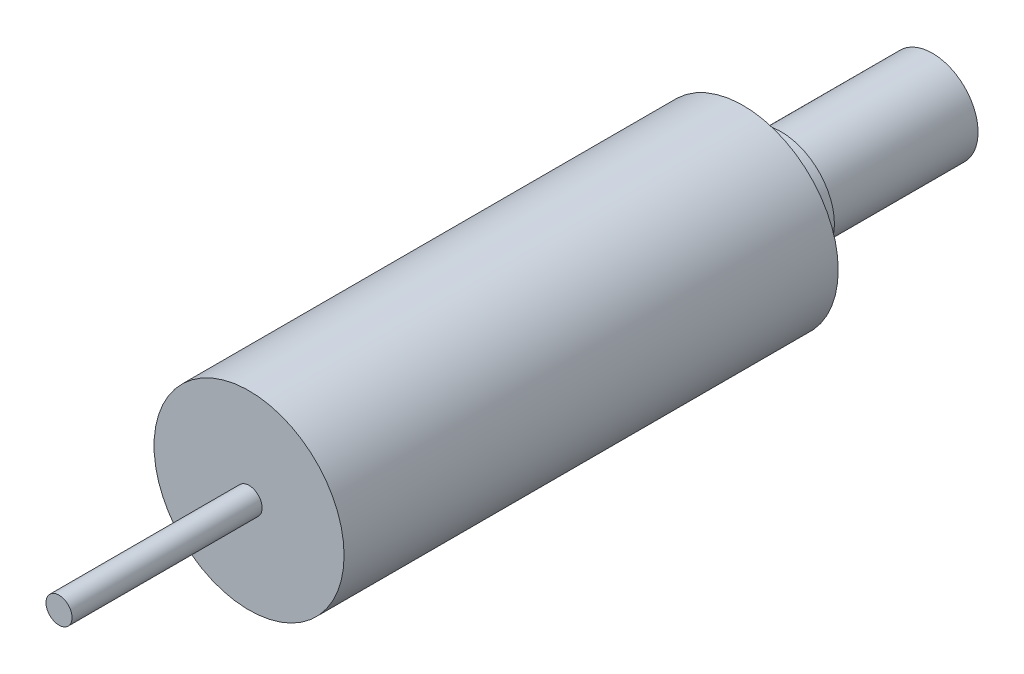
ISO-10303-21;
HEADER;
FILE_DESCRIPTION(('STEP AP214'),'2;1');
FILE_NAME('part.step','',(''),(''),'','','');
FILE_SCHEMA(('AUTOMOTIVE_DESIGN { 1 0 10303 214 1 1 1 1 }'));
ENDSEC;
DATA;
#1=APPLICATION_CONTEXT('core data for automotive mechanical design processes');
#2=APPLICATION_PROTOCOL_DEFINITION('international standard','automotive_design',2000,#1);
#3=PRODUCT_CONTEXT('',#1,'mechanical');
#4=PRODUCT('Part','Part','',(#3));
#5=PRODUCT_RELATED_PRODUCT_CATEGORY('part','',(#4));
#6=PRODUCT_DEFINITION_FORMATION('','',#4);
#7=PRODUCT_DEFINITION_CONTEXT('part definition',#1,'design');
#8=PRODUCT_DEFINITION('design','',#6,#7);
#9=PRODUCT_DEFINITION_SHAPE('','',#8);
#10=(LENGTH_UNIT() NAMED_UNIT(*) SI_UNIT(.MILLI.,.METRE.));
#11=(NAMED_UNIT(*) PLANE_ANGLE_UNIT() SI_UNIT($,.RADIAN.));
#12=(NAMED_UNIT(*) SI_UNIT($,.STERADIAN.) SOLID_ANGLE_UNIT());
#13=UNCERTAINTY_MEASURE_WITH_UNIT(LENGTH_MEASURE(1.E-05),#10,'distance_accuracy_value','');
#14=(GEOMETRIC_REPRESENTATION_CONTEXT(3) GLOBAL_UNCERTAINTY_ASSIGNED_CONTEXT((#13)) GLOBAL_UNIT_ASSIGNED_CONTEXT((#10,
#11,#12)) REPRESENTATION_CONTEXT('',''));
#15=CARTESIAN_POINT('',(0.,0.,0.));
#16=DIRECTION('',(0.,0.,1.));
#17=DIRECTION('',(1.,0.,0.));
#18=AXIS2_PLACEMENT_3D('',#15,#16,#17);
#19=CARTESIAN_POINT('',(0.,0.,19.9));
#20=DIRECTION('',(0.,0.,-1.));
#21=DIRECTION('',(-1.,0.,0.));
#22=AXIS2_PLACEMENT_3D('',#19,#20,#21);
#23=CYLINDRICAL_SURFACE('',#22,6.00000000000001);
#24=CARTESIAN_POINT('',(0.,0.,19.9));
#25=DIRECTION('',(0.,0.,1.));
#26=DIRECTION('',(1.,0.,0.));
#27=AXIS2_PLACEMENT_3D('',#24,#25,#26);
#28=CIRCLE('',#27,6.00000000000001);
#29=CARTESIAN_POINT('',(-6.00000000000001,0.,19.9));
#30=VERTEX_POINT('',#29);
#31=EDGE_CURVE('E10',#30,#30,#28,.T.);
#32=CARTESIAN_POINT('',(0.,0.,0.));
#33=DIRECTION('',(0.,0.,1.));
#34=DIRECTION('',(1.,0.,0.));
#35=AXIS2_PLACEMENT_3D('',#32,#33,#34);
#36=CIRCLE('',#35,6.00000000000001);
#37=CARTESIAN_POINT('',(-6.00000000000001,0.,0.));
#38=VERTEX_POINT('',#37);
#39=EDGE_CURVE('E33',#38,#38,#36,.T.);
#40=CARTESIAN_POINT('',(-6.00000000000001,0.,19.9));
#41=CARTESIAN_POINT('',(-6.00000000000001,0.,19.6927083333333));
#42=CARTESIAN_POINT('',(-6.00000000000001,0.,19.4854166666667));
#43=CARTESIAN_POINT('',(-6.00000000000001,0.,19.0708333333333));
#44=CARTESIAN_POINT('',(-6.00000000000001,0.,18.8635416666667));
#45=CARTESIAN_POINT('',(-6.00000000000001,0.,18.4489583333333));
#46=CARTESIAN_POINT('',(-6.00000000000001,0.,18.2416666666667));
#47=CARTESIAN_POINT('',(-6.00000000000001,0.,17.8270833333333));
#48=CARTESIAN_POINT('',(-6.00000000000001,0.,17.6197916666667));
#49=CARTESIAN_POINT('',(-6.00000000000001,0.,17.2052083333333));
#50=CARTESIAN_POINT('',(-6.00000000000001,0.,16.9979166666667));
#51=CARTESIAN_POINT('',(-6.00000000000001,0.,16.5833333333333));
#52=CARTESIAN_POINT('',(-6.00000000000001,0.,16.3760416666667));
#53=CARTESIAN_POINT('',(-6.00000000000001,0.,15.9614583333333));
#54=CARTESIAN_POINT('',(-6.00000000000001,0.,15.7541666666667));
#55=CARTESIAN_POINT('',(-6.00000000000001,0.,15.3395833333333));
#56=CARTESIAN_POINT('',(-6.00000000000001,0.,15.1322916666667));
#57=CARTESIAN_POINT('',(-6.00000000000001,0.,14.7177083333333));
#58=CARTESIAN_POINT('',(-6.00000000000001,0.,14.5104166666667));
#59=CARTESIAN_POINT('',(-6.00000000000001,0.,14.0958333333333));
#60=CARTESIAN_POINT('',(-6.00000000000001,0.,13.8885416666667));
#61=CARTESIAN_POINT('',(-6.00000000000001,0.,13.4739583333333));
#62=CARTESIAN_POINT('',(-6.00000000000001,0.,13.2666666666667));
#63=CARTESIAN_POINT('',(-6.00000000000001,0.,12.8520833333333));
#64=CARTESIAN_POINT('',(-6.00000000000001,0.,12.6447916666667));
#65=CARTESIAN_POINT('',(-6.00000000000001,0.,12.2302083333333));
#66=CARTESIAN_POINT('',(-6.00000000000001,0.,12.0229166666667));
#67=CARTESIAN_POINT('',(-6.00000000000001,0.,11.6083333333333));
#68=CARTESIAN_POINT('',(-6.00000000000001,0.,11.4010416666667));
#69=CARTESIAN_POINT('',(-6.00000000000001,0.,10.9864583333333));
#70=CARTESIAN_POINT('',(-6.00000000000001,0.,10.7791666666667));
#71=CARTESIAN_POINT('',(-6.00000000000001,0.,10.3645833333333));
#72=CARTESIAN_POINT('',(-6.00000000000001,0.,10.1572916666667));
#73=CARTESIAN_POINT('',(-6.00000000000001,0.,9.74270833333333));
#74=CARTESIAN_POINT('',(-6.00000000000001,0.,9.53541666666666));
#75=CARTESIAN_POINT('',(-6.00000000000001,0.,9.12083333333333));
#76=CARTESIAN_POINT('',(-6.00000000000001,0.,8.91354166666666));
#77=CARTESIAN_POINT('',(-6.00000000000001,0.,8.49895833333333));
#78=CARTESIAN_POINT('',(-6.00000000000001,0.,8.29166666666666));
#79=CARTESIAN_POINT('',(-6.00000000000001,0.,7.87708333333333));
#80=CARTESIAN_POINT('',(-6.00000000000001,0.,7.66979166666666));
#81=CARTESIAN_POINT('',(-6.00000000000001,0.,7.25520833333333));
#82=CARTESIAN_POINT('',(-6.00000000000001,0.,7.04791666666666));
#83=CARTESIAN_POINT('',(-6.00000000000001,0.,6.63333333333333));
#84=CARTESIAN_POINT('',(-6.00000000000001,0.,6.42604166666666));
#85=CARTESIAN_POINT('',(-6.00000000000001,0.,6.01145833333333));
#86=CARTESIAN_POINT('',(-6.00000000000001,0.,5.80416666666666));
#87=CARTESIAN_POINT('',(-6.00000000000001,0.,5.38958333333333));
#88=CARTESIAN_POINT('',(-6.00000000000001,0.,5.18229166666666));
#89=CARTESIAN_POINT('',(-6.00000000000001,0.,4.76770833333333));
#90=CARTESIAN_POINT('',(-6.00000000000001,0.,4.56041666666666));
#91=CARTESIAN_POINT('',(-6.00000000000001,0.,4.14583333333333));
#92=CARTESIAN_POINT('',(-6.00000000000001,0.,3.93854166666666));
#93=CARTESIAN_POINT('',(-6.00000000000001,0.,3.52395833333333));
#94=CARTESIAN_POINT('',(-6.00000000000001,0.,3.31666666666667));
#95=CARTESIAN_POINT('',(-6.00000000000001,0.,2.90208333333333));
#96=CARTESIAN_POINT('',(-6.00000000000001,0.,2.69479166666667));
#97=CARTESIAN_POINT('',(-6.00000000000001,0.,2.28020833333333));
#98=CARTESIAN_POINT('',(-6.00000000000001,0.,2.07291666666667));
#99=CARTESIAN_POINT('',(-6.00000000000001,0.,1.65833333333333));
#100=CARTESIAN_POINT('',(-6.00000000000001,0.,1.45104166666667));
#101=CARTESIAN_POINT('',(-6.00000000000001,0.,1.03645833333333));
#102=CARTESIAN_POINT('',(-6.00000000000001,0.,0.829166666666668));
#103=CARTESIAN_POINT('',(-6.00000000000001,0.,0.414583333333334));
#104=CARTESIAN_POINT('',(-6.00000000000001,0.,0.207291666666667));
#105=CARTESIAN_POINT('',(-6.00000000000001,0.,0.));
#106=B_SPLINE_CURVE_WITH_KNOTS('',3,(#40,#41,#42,#43,#44,#45,#46,#47,#48,#49,#50,#51,#52,#53,
#54,#55,#56,#57,#58,#59,#60,#61,#62,#63,#64,#65,#66,#67,#68,#69,#70,#71,#72,#73,#74,#75,#76,#77,
#78,#79,#80,#81,#82,#83,#84,#85,#86,#87,#88,#89,#90,#91,#92,#93,#94,#95,#96,#97,#98,#99,#100,
#101,#102,#103,#104,#105),.UNSPECIFIED.,.F.,.F.,(4,2,2,2,2,2,2,2,2,2,2,2,2,2,2,2,2,2,2,2,2,2,2,
2,2,2,2,2,2,2,2,2,4),(0.,0.621875000000001,1.24375,1.865625,2.4875,3.109375,3.73125,4.353125,
4.975,5.596875,6.21875,6.840625,7.4625,8.084375,8.70625,9.328125,9.95,10.571875,11.19375,
11.815625,12.4375,13.059375,13.68125,14.303125,14.925,15.546875,16.16875,16.790625,17.4125,
18.034375,18.65625,19.278125,19.9),.UNSPECIFIED.);
#107=EDGE_CURVE('BSEAM30',#30,#38,#106,.T.);
#108=ORIENTED_EDGE('',*,*,#31,.F.);
#109=ORIENTED_EDGE('',*,*,#39,.T.);
#110=ORIENTED_EDGE('',*,*,#107,.T.);
#111=ORIENTED_EDGE('',*,*,#107,.F.);
#112=EDGE_LOOP('',(#108,#110,#109,#111));
#113=FACE_BOUND('',#112,.T.);
#114=ADVANCED_FACE('F30',(#113),#23,.T.);
#115=CARTESIAN_POINT('',(0.,0.,0.));
#116=DIRECTION('',(0.,0.,1.));
#117=DIRECTION('',(1.,0.,0.));
#118=AXIS2_PLACEMENT_3D('',#115,#116,#117);
#119=PLANE('',#118);
#120=CARTESIAN_POINT('',(0.,0.,0.));
#121=DIRECTION('',(0.,0.,-1.));
#122=DIRECTION('',(-1.,0.,0.));
#123=AXIS2_PLACEMENT_3D('',#120,#121,#122);
#124=CIRCLE('',#123,3.);
#125=CARTESIAN_POINT('',(-3.,0.,0.));
#126=VERTEX_POINT('',#125);
#127=EDGE_CURVE('E60',#126,#126,#124,.T.);
#128=ORIENTED_EDGE('',*,*,#127,.F.);
#129=EDGE_LOOP('',(#128));
#130=FACE_BOUND('',#129,.T.);
#131=ORIENTED_EDGE('',*,*,#39,.F.);
#132=EDGE_LOOP('',(#131));
#133=FACE_BOUND('',#132,.T.);
#134=ADVANCED_FACE('F75',(#130,#133),#119,.F.);
#135=CARTESIAN_POINT('',(0.,0.,24.9));
#136=DIRECTION('',(0.,0.,-1.));
#137=DIRECTION('',(-1.,0.,0.));
#138=AXIS2_PLACEMENT_3D('',#135,#136,#137);
#139=CYLINDRICAL_SURFACE('',#138,7.);
#140=CARTESIAN_POINT('',(0.,0.,24.9));
#141=DIRECTION('',(0.,0.,1.));
#142=DIRECTION('',(1.,0.,0.));
#143=AXIS2_PLACEMENT_3D('',#140,#141,#142);
#144=CIRCLE('',#143,7.);
#145=CARTESIAN_POINT('',(7.,0.,24.9));
#146=VERTEX_POINT('',#145);
#147=EDGE_CURVE('E40',#146,#146,#144,.T.);
#148=ORIENTED_EDGE('',*,*,#147,.F.);
#149=EDGE_LOOP('',(#148));
#150=FACE_BOUND('',#149,.T.);
#151=CARTESIAN_POINT('',(0.,0.,19.9));
#152=DIRECTION('',(0.,0.,1.));
#153=DIRECTION('',(1.,0.,0.));
#154=AXIS2_PLACEMENT_3D('',#151,#152,#153);
#155=CIRCLE('',#154,7.);
#156=CARTESIAN_POINT('',(7.,0.,19.9));
#157=VERTEX_POINT('',#156);
#158=EDGE_CURVE('E42',#157,#157,#155,.T.);
#159=ORIENTED_EDGE('',*,*,#158,.T.);
#160=EDGE_LOOP('',(#159));
#161=FACE_BOUND('',#160,.T.);
#162=ADVANCED_FACE('F78',(#150,#161),#139,.T.);
#163=CARTESIAN_POINT('',(0.,0.,19.9));
#164=DIRECTION('',(0.,0.,1.));
#165=DIRECTION('',(1.,0.,0.));
#166=AXIS2_PLACEMENT_3D('',#163,#164,#165);
#167=PLANE('',#166);
#168=ORIENTED_EDGE('',*,*,#31,.T.);
#169=EDGE_LOOP('',(#168));
#170=FACE_BOUND('',#169,.T.);
#171=ORIENTED_EDGE('',*,*,#158,.F.);
#172=EDGE_LOOP('',(#171));
#173=FACE_BOUND('',#172,.T.);
#174=ADVANCED_FACE('F97',(#170,#173),#167,.F.);
#175=CARTESIAN_POINT('',(0.,0.,89.9));
#176=DIRECTION('',(0.,0.,-1.));
#177=DIRECTION('',(-1.,0.,0.));
#178=AXIS2_PLACEMENT_3D('',#175,#176,#177);
#179=CYLINDRICAL_SURFACE('',#178,12.5);
#180=CARTESIAN_POINT('',(0.,0.,89.9));
#181=DIRECTION('',(0.,0.,1.));
#182=DIRECTION('',(1.,0.,0.));
#183=AXIS2_PLACEMENT_3D('',#180,#181,#182);
#184=CIRCLE('',#183,12.5);
#185=CARTESIAN_POINT('',(12.5,0.,89.9));
#186=VERTEX_POINT('',#185);
#187=EDGE_CURVE('E45',#186,#186,#184,.T.);
#188=ORIENTED_EDGE('',*,*,#187,.F.);
#189=EDGE_LOOP('',(#188));
#190=FACE_BOUND('',#189,.T.);
#191=CARTESIAN_POINT('',(0.,0.,24.9));
#192=DIRECTION('',(0.,0.,1.));
#193=DIRECTION('',(1.,0.,0.));
#194=AXIS2_PLACEMENT_3D('',#191,#192,#193);
#195=CIRCLE('',#194,12.5);
#196=CARTESIAN_POINT('',(12.5,0.,24.9));
#197=VERTEX_POINT('',#196);
#198=EDGE_CURVE('E48',#197,#197,#195,.T.);
#199=ORIENTED_EDGE('',*,*,#198,.T.);
#200=EDGE_LOOP('',(#199));
#201=FACE_BOUND('',#200,.T.);
#202=ADVANCED_FACE('F105',(#190,#201),#179,.T.);
#203=CARTESIAN_POINT('',(0.,0.,89.9));
#204=DIRECTION('',(0.,0.,1.));
#205=DIRECTION('',(1.,0.,0.));
#206=AXIS2_PLACEMENT_3D('',#203,#204,#205);
#207=PLANE('',#206);
#208=CARTESIAN_POINT('',(0.,0.,89.9));
#209=DIRECTION('',(0.,0.,1.));
#210=DIRECTION('',(1.,0.,0.));
#211=AXIS2_PLACEMENT_3D('',#208,#209,#210);
#212=CIRCLE('',#211,1.7148709961768);
#213=CARTESIAN_POINT('',(1.7148709961768,0.,89.9));
#214=VERTEX_POINT('',#213);
#215=EDGE_CURVE('E54',#214,#214,#212,.T.);
#216=ORIENTED_EDGE('',*,*,#215,.F.);
#217=EDGE_LOOP('',(#216));
#218=FACE_BOUND('',#217,.T.);
#219=ORIENTED_EDGE('',*,*,#187,.T.);
#220=EDGE_LOOP('',(#219));
#221=FACE_BOUND('',#220,.T.);
#222=ADVANCED_FACE('F112',(#218,#221),#207,.T.);
#223=CARTESIAN_POINT('',(0.,0.,24.9));
#224=DIRECTION('',(0.,0.,1.));
#225=DIRECTION('',(1.,0.,0.));
#226=AXIS2_PLACEMENT_3D('',#223,#224,#225);
#227=PLANE('',#226);
#228=ORIENTED_EDGE('',*,*,#147,.T.);
#229=EDGE_LOOP('',(#228));
#230=FACE_BOUND('',#229,.T.);
#231=ORIENTED_EDGE('',*,*,#198,.F.);
#232=EDGE_LOOP('',(#231));
#233=FACE_BOUND('',#232,.T.);
#234=ADVANCED_FACE('F121',(#230,#233),#227,.F.);
#235=CARTESIAN_POINT('',(0.,0.,114.9));
#236=DIRECTION('',(0.,0.,-1.));
#237=DIRECTION('',(-1.,0.,0.));
#238=AXIS2_PLACEMENT_3D('',#235,#236,#237);
#239=CYLINDRICAL_SURFACE('',#238,1.7148709961768);
#240=CARTESIAN_POINT('',(0.,0.,114.9));
#241=DIRECTION('',(0.,0.,1.));
#242=DIRECTION('',(1.,0.,0.));
#243=AXIS2_PLACEMENT_3D('',#240,#241,#242);
#244=CIRCLE('',#243,1.7148709961768);
#245=CARTESIAN_POINT('',(1.7148709961768,0.,114.9));
#246=VERTEX_POINT('',#245);
#247=EDGE_CURVE('E51',#246,#246,#244,.T.);
#248=ORIENTED_EDGE('',*,*,#247,.F.);
#249=EDGE_LOOP('',(#248));
#250=FACE_BOUND('',#249,.T.);
#251=ORIENTED_EDGE('',*,*,#215,.T.);
#252=EDGE_LOOP('',(#251));
#253=FACE_BOUND('',#252,.T.);
#254=ADVANCED_FACE('F129',(#250,#253),#239,.T.);
#255=CARTESIAN_POINT('',(0.,0.,114.9));
#256=DIRECTION('',(0.,0.,1.));
#257=DIRECTION('',(1.,0.,0.));
#258=AXIS2_PLACEMENT_3D('',#255,#256,#257);
#259=PLANE('',#258);
#260=ORIENTED_EDGE('',*,*,#247,.T.);
#261=EDGE_LOOP('',(#260));
#262=FACE_BOUND('',#261,.T.);
#263=ADVANCED_FACE('F71',(#262),#259,.T.);
#264=CARTESIAN_POINT('',(0.,0.,10.));
#265=DIRECTION('',(0.,0.,-1.));
#266=DIRECTION('',(-1.,0.,0.));
#267=AXIS2_PLACEMENT_3D('',#264,#265,#266);
#268=CYLINDRICAL_SURFACE('',#267,3.);
#269=CARTESIAN_POINT('',(0.,0.,10.));
#270=DIRECTION('',(0.,0.,-1.));
#271=DIRECTION('',(-1.,0.,0.));
#272=AXIS2_PLACEMENT_3D('',#269,#270,#271);
#273=CIRCLE('',#272,3.);
#274=CARTESIAN_POINT('',(-3.,0.,10.));
#275=VERTEX_POINT('',#274);
#276=EDGE_CURVE('E57',#275,#275,#273,.T.);
#277=ORIENTED_EDGE('',*,*,#276,.F.);
#278=EDGE_LOOP('',(#277));
#279=FACE_BOUND('',#278,.T.);
#280=ORIENTED_EDGE('',*,*,#127,.T.);
#281=EDGE_LOOP('',(#280));
#282=FACE_BOUND('',#281,.T.);
#283=ADVANCED_FACE('F68',(#279,#282),#268,.F.);
#284=CARTESIAN_POINT('',(0.,0.,10.));
#285=DIRECTION('',(0.,0.,-1.));
#286=DIRECTION('',(-1.,0.,0.));
#287=AXIS2_PLACEMENT_3D('',#284,#285,#286);
#288=PLANE('',#287);
#289=ORIENTED_EDGE('',*,*,#276,.T.);
#290=EDGE_LOOP('',(#289));
#291=FACE_BOUND('',#290,.T.);
#292=ADVANCED_FACE('F66',(#291),#288,.T.);
#293=CLOSED_SHELL('',(#114,#134,#162,#174,#202,#222,#234,#254,#263,#283,#292));
#294=MANIFOLD_SOLID_BREP('B2',#293);
#295=ADVANCED_BREP_SHAPE_REPRESENTATION('',(#18,#294),#14);
#296=SHAPE_DEFINITION_REPRESENTATION(#9,#295);
ENDSEC;
END-ISO-10303-21;
